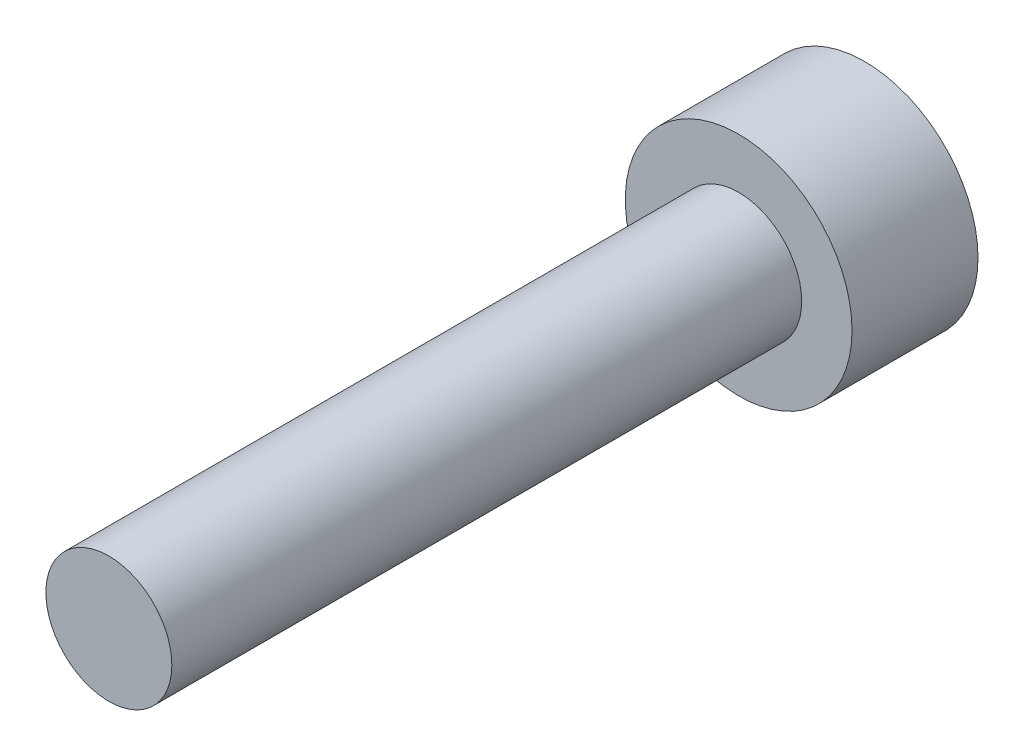
ISO-10303-21;
HEADER;
FILE_DESCRIPTION(('STEP AP214'),'2;1');
FILE_NAME('part.step','',(''),(''),'','','');
FILE_SCHEMA(('AUTOMOTIVE_DESIGN { 1 0 10303 214 1 1 1 1 }'));
ENDSEC;
DATA;
#1=APPLICATION_CONTEXT('core data for automotive mechanical design processes');
#2=APPLICATION_PROTOCOL_DEFINITION('international standard','automotive_design',2000,#1);
#3=PRODUCT_CONTEXT('',#1,'mechanical');
#4=PRODUCT('Part','Part','',(#3));
#5=PRODUCT_RELATED_PRODUCT_CATEGORY('part','',(#4));
#6=PRODUCT_DEFINITION_FORMATION('','',#4);
#7=PRODUCT_DEFINITION_CONTEXT('part definition',#1,'design');
#8=PRODUCT_DEFINITION('design','',#6,#7);
#9=PRODUCT_DEFINITION_SHAPE('','',#8);
#10=(LENGTH_UNIT() NAMED_UNIT(*) SI_UNIT(.MILLI.,.METRE.));
#11=(NAMED_UNIT(*) PLANE_ANGLE_UNIT() SI_UNIT($,.RADIAN.));
#12=(NAMED_UNIT(*) SI_UNIT($,.STERADIAN.) SOLID_ANGLE_UNIT());
#13=UNCERTAINTY_MEASURE_WITH_UNIT(LENGTH_MEASURE(1.E-05),#10,'distance_accuracy_value','');
#14=(GEOMETRIC_REPRESENTATION_CONTEXT(3) GLOBAL_UNCERTAINTY_ASSIGNED_CONTEXT((#13)) GLOBAL_UNIT_ASSIGNED_CONTEXT((#10,
#11,#12)) REPRESENTATION_CONTEXT('',''));
#15=CARTESIAN_POINT('',(0.,0.,0.));
#16=DIRECTION('',(0.,0.,1.));
#17=DIRECTION('',(1.,0.,0.));
#18=AXIS2_PLACEMENT_3D('',#15,#16,#17);
#19=CARTESIAN_POINT('',(0.,0.,4.));
#20=DIRECTION('',(0.,0.,-1.));
#21=DIRECTION('',(-1.,0.,0.));
#22=AXIS2_PLACEMENT_3D('',#19,#20,#21);
#23=CYLINDRICAL_SURFACE('',#22,3.6);
#24=CARTESIAN_POINT('',(0.,0.,4.));
#25=DIRECTION('',(0.,0.,1.));
#26=DIRECTION('',(1.,0.,0.));
#27=AXIS2_PLACEMENT_3D('',#24,#25,#26);
#28=CIRCLE('',#27,3.6);
#29=CARTESIAN_POINT('',(3.6,0.,4.));
#30=VERTEX_POINT('',#29);
#31=EDGE_CURVE('E11',#30,#30,#28,.T.);
#32=ORIENTED_EDGE('',*,*,#31,.F.);
#33=EDGE_LOOP('',(#32));
#34=FACE_BOUND('',#33,.T.);
#35=CARTESIAN_POINT('',(0.,0.,0.));
#36=DIRECTION('',(0.,0.,1.));
#37=DIRECTION('',(1.,0.,0.));
#38=AXIS2_PLACEMENT_3D('',#35,#36,#37);
#39=CIRCLE('',#38,3.6);
#40=CARTESIAN_POINT('',(3.6,0.,0.));
#41=VERTEX_POINT('',#40);
#42=EDGE_CURVE('E40',#41,#41,#39,.T.);
#43=ORIENTED_EDGE('',*,*,#42,.T.);
#44=EDGE_LOOP('',(#43));
#45=FACE_BOUND('',#44,.T.);
#46=ADVANCED_FACE('F37',(#34,#45),#23,.T.);
#47=CARTESIAN_POINT('',(0.,0.,4.));
#48=DIRECTION('',(0.,0.,1.));
#49=DIRECTION('',(1.,0.,0.));
#50=AXIS2_PLACEMENT_3D('',#47,#48,#49);
#51=PLANE('',#50);
#52=CARTESIAN_POINT('',(0.,0.,4.));
#53=DIRECTION('',(0.,0.,1.));
#54=DIRECTION('',(1.,0.,0.));
#55=AXIS2_PLACEMENT_3D('',#52,#53,#54);
#56=CIRCLE('',#55,2.);
#57=CARTESIAN_POINT('',(2.,0.,4.));
#58=VERTEX_POINT('',#57);
#59=EDGE_CURVE('E138',#58,#58,#56,.T.);
#60=ORIENTED_EDGE('',*,*,#59,.F.);
#61=EDGE_LOOP('',(#60));
#62=FACE_BOUND('',#61,.T.);
#63=ORIENTED_EDGE('',*,*,#31,.T.);
#64=EDGE_LOOP('',(#63));
#65=FACE_BOUND('',#64,.T.);
#66=ADVANCED_FACE('F152',(#62,#65),#51,.T.);
#67=CARTESIAN_POINT('',(0.,0.,0.));
#68=DIRECTION('',(0.,0.,1.));
#69=DIRECTION('',(1.,0.,0.));
#70=AXIS2_PLACEMENT_3D('',#67,#68,#69);
#71=PLANE('',#70);
#72=DIRECTION('',(0.967973470177789,0.251052506523971,0.));
#73=VECTOR('',#72,1.);
#74=CARTESIAN_POINT('',(-1.24726486515328,1.26746348645138,0.));
#75=LINE('',#74,#73);
#76=CARTESIAN_POINT('',(-1.24726486515328,1.26746348645138,0.));
#77=VERTEX_POINT('',#76);
#78=CARTESIAN_POINT('',(0.47402314505945,1.71389480169621,0.));
#79=VERTEX_POINT('',#78);
#80=EDGE_CURVE('E125',#77,#79,#75,.T.);
#81=ORIENTED_EDGE('',*,*,#80,.F.);
#82=DIRECTION('',(0.266568886755377,0.96381586862533,0.));
#83=VECTOR('',#82,1.);
#84=CARTESIAN_POINT('',(-1.72128801021273,-0.446431315244822,0.));
#85=LINE('',#84,#83);
#86=CARTESIAN_POINT('',(-1.72128801021273,-0.446431315244822,0.));
#87=VERTEX_POINT('',#86);
#88=EDGE_CURVE('E51',#87,#77,#85,.T.);
#89=ORIENTED_EDGE('',*,*,#88,.F.);
#90=DIRECTION('',(-0.701404583422412,0.712763362101359,0.));
#91=VECTOR('',#90,1.);
#92=CARTESIAN_POINT('',(-0.47402314505945,-1.71389480169621,0.));
#93=LINE('',#92,#91);
#94=CARTESIAN_POINT('',(-0.47402314505945,-1.71389480169621,0.));
#95=VERTEX_POINT('',#94);
#96=EDGE_CURVE('E134',#95,#87,#93,.T.);
#97=ORIENTED_EDGE('',*,*,#96,.F.);
#98=DIRECTION('',(-0.967973470177789,-0.251052506523971,0.));
#99=VECTOR('',#98,1.);
#100=CARTESIAN_POINT('',(1.24726486515328,-1.26746348645138,0.));
#101=LINE('',#100,#99);
#102=CARTESIAN_POINT('',(1.24726486515328,-1.26746348645138,0.));
#103=VERTEX_POINT('',#102);
#104=EDGE_CURVE('E132',#103,#95,#101,.T.);
#105=ORIENTED_EDGE('',*,*,#104,.F.);
#106=DIRECTION('',(-0.266568886755377,-0.96381586862533,0.));
#107=VECTOR('',#106,1.);
#108=CARTESIAN_POINT('',(1.72128801021273,0.446431315244822,0.));
#109=LINE('',#108,#107);
#110=CARTESIAN_POINT('',(1.72128801021273,0.446431315244822,0.));
#111=VERTEX_POINT('',#110);
#112=EDGE_CURVE('E99',#111,#103,#109,.T.);
#113=ORIENTED_EDGE('',*,*,#112,.F.);
#114=DIRECTION('',(0.701404583422412,-0.712763362101359,0.));
#115=VECTOR('',#114,1.);
#116=CARTESIAN_POINT('',(0.47402314505945,1.71389480169621,0.));
#117=LINE('',#116,#115);
#118=EDGE_CURVE('E128',#79,#111,#117,.T.);
#119=ORIENTED_EDGE('',*,*,#118,.F.);
#120=EDGE_LOOP('',(#81,#89,#97,#105,#113,#119));
#121=FACE_BOUND('',#120,.T.);
#122=ORIENTED_EDGE('',*,*,#42,.F.);
#123=EDGE_LOOP('',(#122));
#124=FACE_BOUND('',#123,.T.);
#125=ADVANCED_FACE('F155',(#121,#124),#71,.F.);
#126=CARTESIAN_POINT('',(0.,0.,24.));
#127=DIRECTION('',(0.,0.,-1.));
#128=DIRECTION('',(-1.,0.,0.));
#129=AXIS2_PLACEMENT_3D('',#126,#127,#128);
#130=CYLINDRICAL_SURFACE('',#129,2.);
#131=CARTESIAN_POINT('',(0.,0.,24.));
#132=DIRECTION('',(0.,0.,1.));
#133=DIRECTION('',(1.,0.,0.));
#134=AXIS2_PLACEMENT_3D('',#131,#132,#133);
#135=CIRCLE('',#134,2.);
#136=CARTESIAN_POINT('',(2.,0.,24.));
#137=VERTEX_POINT('',#136);
#138=EDGE_CURVE('E144',#137,#137,#135,.T.);
#139=ORIENTED_EDGE('',*,*,#138,.F.);
#140=EDGE_LOOP('',(#139));
#141=FACE_BOUND('',#140,.T.);
#142=ORIENTED_EDGE('',*,*,#59,.T.);
#143=EDGE_LOOP('',(#142));
#144=FACE_BOUND('',#143,.T.);
#145=ADVANCED_FACE('F150',(#141,#144),#130,.T.);
#146=CARTESIAN_POINT('',(0.,0.,24.));
#147=DIRECTION('',(0.,0.,1.));
#148=DIRECTION('',(1.,0.,0.));
#149=AXIS2_PLACEMENT_3D('',#146,#147,#148);
#150=PLANE('',#149);
#151=ORIENTED_EDGE('',*,*,#138,.T.);
#152=EDGE_LOOP('',(#151));
#153=FACE_BOUND('',#152,.T.);
#154=ADVANCED_FACE('F169',(#153),#150,.T.);
#155=CARTESIAN_POINT('',(-1.72128801021273,-0.446431315244822,2.));
#156=DIRECTION('',(-0.96381586862533,0.266568886755377,0.));
#157=DIRECTION('',(-0.266568886755377,-0.96381586862533,0.));
#158=AXIS2_PLACEMENT_3D('',#155,#156,#157);
#159=PLANE('',#158);
#160=ORIENTED_EDGE('',*,*,#88,.T.);
#161=DIRECTION('',(0.,0.,-1.));
#162=VECTOR('',#161,1.);
#163=CARTESIAN_POINT('',(-1.24726486515328,1.26746348645138,2.));
#164=LINE('',#163,#162);
#165=CARTESIAN_POINT('',(-1.24726486515328,1.26746348645138,2.));
#166=VERTEX_POINT('',#165);
#167=EDGE_CURVE('E81',#166,#77,#164,.T.);
#168=ORIENTED_EDGE('',*,*,#167,.F.);
#169=DIRECTION('',(0.266568886755377,0.96381586862533,0.));
#170=VECTOR('',#169,1.);
#171=CARTESIAN_POINT('',(-1.72128801021273,-0.446431315244822,2.));
#172=LINE('',#171,#170);
#173=CARTESIAN_POINT('',(-1.72128801021273,-0.446431315244822,2.));
#174=VERTEX_POINT('',#173);
#175=EDGE_CURVE('E136',#174,#166,#172,.T.);
#176=ORIENTED_EDGE('',*,*,#175,.F.);
#177=DIRECTION('',(0.,0.,-1.));
#178=VECTOR('',#177,1.);
#179=CARTESIAN_POINT('',(-1.72128801021273,-0.446431315244822,2.));
#180=LINE('',#179,#178);
#181=EDGE_CURVE('E59',#174,#87,#180,.T.);
#182=ORIENTED_EDGE('',*,*,#181,.T.);
#183=EDGE_LOOP('',(#160,#168,#176,#182));
#184=FACE_BOUND('',#183,.T.);
#185=ADVANCED_FACE('F176',(#184),#159,.F.);
#186=CARTESIAN_POINT('',(-0.47402314505945,-1.71389480169621,2.));
#187=DIRECTION('',(-0.712763362101359,-0.701404583422412,0.));
#188=DIRECTION('',(0.701404583422412,-0.712763362101358,0.));
#189=AXIS2_PLACEMENT_3D('',#186,#187,#188);
#190=PLANE('',#189);
#191=ORIENTED_EDGE('',*,*,#96,.T.);
#192=ORIENTED_EDGE('',*,*,#181,.F.);
#193=DIRECTION('',(-0.701404583422412,0.712763362101359,0.));
#194=VECTOR('',#193,1.);
#195=CARTESIAN_POINT('',(-0.47402314505945,-1.71389480169621,2.));
#196=LINE('',#195,#194);
#197=CARTESIAN_POINT('',(-0.47402314505945,-1.71389480169621,2.));
#198=VERTEX_POINT('',#197);
#199=EDGE_CURVE('E111',#198,#174,#196,.T.);
#200=ORIENTED_EDGE('',*,*,#199,.F.);
#201=DIRECTION('',(0.,0.,-1.));
#202=VECTOR('',#201,1.);
#203=CARTESIAN_POINT('',(-0.47402314505945,-1.71389480169621,2.));
#204=LINE('',#203,#202);
#205=EDGE_CURVE('E103',#198,#95,#204,.T.);
#206=ORIENTED_EDGE('',*,*,#205,.T.);
#207=EDGE_LOOP('',(#191,#192,#200,#206));
#208=FACE_BOUND('',#207,.T.);
#209=ADVANCED_FACE('F180',(#208),#190,.F.);
#210=CARTESIAN_POINT('',(1.24726486515328,-1.26746348645138,2.));
#211=DIRECTION('',(0.251052506523971,-0.967973470177789,0.));
#212=DIRECTION('',(0.967973470177789,0.251052506523971,0.));
#213=AXIS2_PLACEMENT_3D('',#210,#211,#212);
#214=PLANE('',#213);
#215=ORIENTED_EDGE('',*,*,#104,.T.);
#216=ORIENTED_EDGE('',*,*,#205,.F.);
#217=DIRECTION('',(-0.967973470177789,-0.251052506523971,0.));
#218=VECTOR('',#217,1.);
#219=CARTESIAN_POINT('',(1.24726486515328,-1.26746348645138,2.));
#220=LINE('',#219,#218);
#221=CARTESIAN_POINT('',(1.24726486515328,-1.26746348645138,2.));
#222=VERTEX_POINT('',#221);
#223=EDGE_CURVE('E107',#222,#198,#220,.T.);
#224=ORIENTED_EDGE('',*,*,#223,.F.);
#225=DIRECTION('',(0.,0.,-1.));
#226=VECTOR('',#225,1.);
#227=CARTESIAN_POINT('',(1.24726486515328,-1.26746348645138,2.));
#228=LINE('',#227,#226);
#229=EDGE_CURVE('E92',#222,#103,#228,.T.);
#230=ORIENTED_EDGE('',*,*,#229,.T.);
#231=EDGE_LOOP('',(#215,#216,#224,#230));
#232=FACE_BOUND('',#231,.T.);
#233=ADVANCED_FACE('F108',(#232),#214,.F.);
#234=CARTESIAN_POINT('',(1.72128801021273,0.446431315244822,2.));
#235=DIRECTION('',(0.96381586862533,-0.266568886755377,0.));
#236=DIRECTION('',(0.266568886755377,0.96381586862533,0.));
#237=AXIS2_PLACEMENT_3D('',#234,#235,#236);
#238=PLANE('',#237);
#239=ORIENTED_EDGE('',*,*,#112,.T.);
#240=ORIENTED_EDGE('',*,*,#229,.F.);
#241=DIRECTION('',(-0.266568886755377,-0.96381586862533,0.));
#242=VECTOR('',#241,1.);
#243=CARTESIAN_POINT('',(1.72128801021273,0.446431315244822,2.));
#244=LINE('',#243,#242);
#245=CARTESIAN_POINT('',(1.72128801021273,0.446431315244822,2.));
#246=VERTEX_POINT('',#245);
#247=EDGE_CURVE('E96',#246,#222,#244,.T.);
#248=ORIENTED_EDGE('',*,*,#247,.F.);
#249=DIRECTION('',(0.,0.,-1.));
#250=VECTOR('',#249,1.);
#251=CARTESIAN_POINT('',(1.72128801021273,0.446431315244822,2.));
#252=LINE('',#251,#250);
#253=EDGE_CURVE('E104',#246,#111,#252,.T.);
#254=ORIENTED_EDGE('',*,*,#253,.T.);
#255=EDGE_LOOP('',(#239,#240,#248,#254));
#256=FACE_BOUND('',#255,.T.);
#257=ADVANCED_FACE('F94',(#256),#238,.F.);
#258=CARTESIAN_POINT('',(0.47402314505945,1.71389480169621,2.));
#259=DIRECTION('',(0.712763362101359,0.701404583422412,0.));
#260=DIRECTION('',(-0.701404583422412,0.712763362101359,0.));
#261=AXIS2_PLACEMENT_3D('',#258,#259,#260);
#262=PLANE('',#261);
#263=ORIENTED_EDGE('',*,*,#118,.T.);
#264=ORIENTED_EDGE('',*,*,#253,.F.);
#265=DIRECTION('',(0.701404583422412,-0.712763362101359,0.));
#266=VECTOR('',#265,1.);
#267=CARTESIAN_POINT('',(0.47402314505945,1.71389480169621,2.));
#268=LINE('',#267,#266);
#269=CARTESIAN_POINT('',(0.47402314505945,1.71389480169621,2.));
#270=VERTEX_POINT('',#269);
#271=EDGE_CURVE('E117',#270,#246,#268,.T.);
#272=ORIENTED_EDGE('',*,*,#271,.F.);
#273=DIRECTION('',(0.,0.,-1.));
#274=VECTOR('',#273,1.);
#275=CARTESIAN_POINT('',(0.47402314505945,1.71389480169621,2.));
#276=LINE('',#275,#274);
#277=EDGE_CURVE('E141',#270,#79,#276,.T.);
#278=ORIENTED_EDGE('',*,*,#277,.T.);
#279=EDGE_LOOP('',(#263,#264,#272,#278));
#280=FACE_BOUND('',#279,.T.);
#281=ADVANCED_FACE('F184',(#280),#262,.F.);
#282=CARTESIAN_POINT('',(-1.24726486515328,1.26746348645138,2.));
#283=DIRECTION('',(-0.251052506523971,0.967973470177789,0.));
#284=DIRECTION('',(-0.967973470177789,-0.251052506523971,0.));
#285=AXIS2_PLACEMENT_3D('',#282,#283,#284);
#286=PLANE('',#285);
#287=ORIENTED_EDGE('',*,*,#80,.T.);
#288=ORIENTED_EDGE('',*,*,#277,.F.);
#289=DIRECTION('',(0.967973470177789,0.251052506523971,0.));
#290=VECTOR('',#289,1.);
#291=CARTESIAN_POINT('',(-1.24726486515328,1.26746348645138,2.));
#292=LINE('',#291,#290);
#293=EDGE_CURVE('E119',#166,#270,#292,.T.);
#294=ORIENTED_EDGE('',*,*,#293,.F.);
#295=ORIENTED_EDGE('',*,*,#167,.T.);
#296=EDGE_LOOP('',(#287,#288,#294,#295));
#297=FACE_BOUND('',#296,.T.);
#298=ADVANCED_FACE('F181',(#297),#286,.F.);
#299=CARTESIAN_POINT('',(0.,0.,2.));
#300=DIRECTION('',(0.,0.,-1.));
#301=DIRECTION('',(-1.,0.,0.));
#302=AXIS2_PLACEMENT_3D('',#299,#300,#301);
#303=PLANE('',#302);
#304=ORIENTED_EDGE('',*,*,#175,.T.);
#305=ORIENTED_EDGE('',*,*,#293,.T.);
#306=ORIENTED_EDGE('',*,*,#271,.T.);
#307=ORIENTED_EDGE('',*,*,#247,.T.);
#308=ORIENTED_EDGE('',*,*,#223,.T.);
#309=ORIENTED_EDGE('',*,*,#199,.T.);
#310=EDGE_LOOP('',(#304,#305,#306,#307,#308,#309));
#311=FACE_BOUND('',#310,.T.);
#312=ADVANCED_FACE('F114',(#311),#303,.T.);
#313=CLOSED_SHELL('',(#46,#66,#125,#145,#154,#185,#209,#233,#257,#281,#298,#312));
#314=MANIFOLD_SOLID_BREP('B2',#313);
#315=ADVANCED_BREP_SHAPE_REPRESENTATION('',(#18,#314),#14);
#316=SHAPE_DEFINITION_REPRESENTATION(#9,#315);
ENDSEC;
END-ISO-10303-21;
